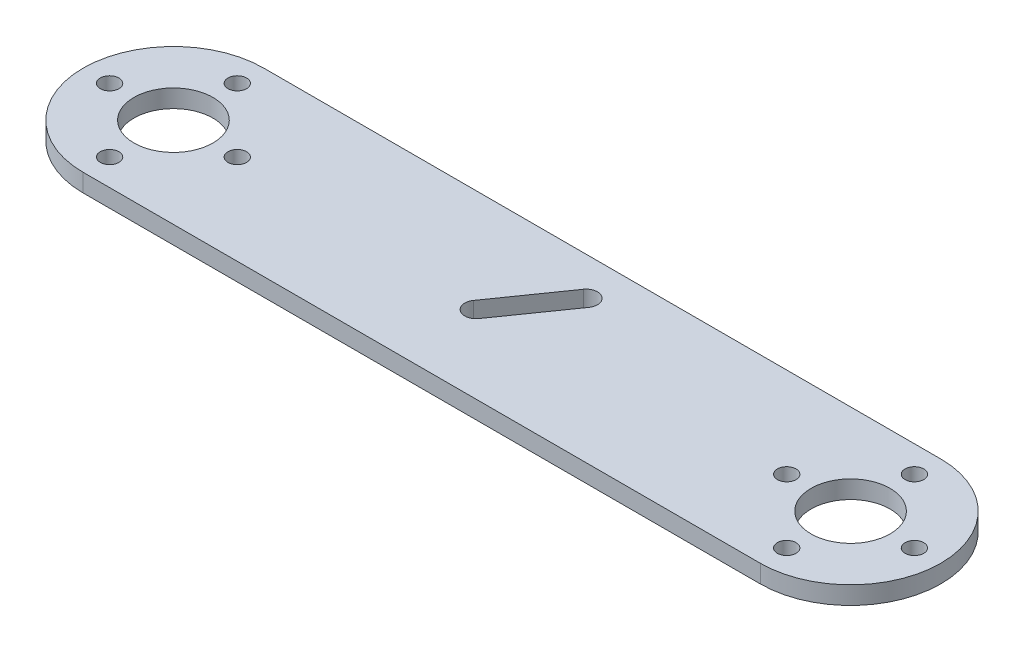
ISO-10303-21;
HEADER;
FILE_DESCRIPTION(('STEP AP214'),'2;1');
FILE_NAME('part.step','',(''),(''),'','','');
FILE_SCHEMA(('AUTOMOTIVE_DESIGN { 1 0 10303 214 1 1 1 1 }'));
ENDSEC;
DATA;
#1=APPLICATION_CONTEXT('core data for automotive mechanical design processes');
#2=APPLICATION_PROTOCOL_DEFINITION('international standard','automotive_design',2000,#1);
#3=PRODUCT_CONTEXT('',#1,'mechanical');
#4=PRODUCT('Part','Part','',(#3));
#5=PRODUCT_RELATED_PRODUCT_CATEGORY('part','',(#4));
#6=PRODUCT_DEFINITION_FORMATION('','',#4);
#7=PRODUCT_DEFINITION_CONTEXT('part definition',#1,'design');
#8=PRODUCT_DEFINITION('design','',#6,#7);
#9=PRODUCT_DEFINITION_SHAPE('','',#8);
#10=(LENGTH_UNIT() NAMED_UNIT(*) SI_UNIT(.MILLI.,.METRE.));
#11=(NAMED_UNIT(*) PLANE_ANGLE_UNIT() SI_UNIT($,.RADIAN.));
#12=(NAMED_UNIT(*) SI_UNIT($,.STERADIAN.) SOLID_ANGLE_UNIT());
#13=UNCERTAINTY_MEASURE_WITH_UNIT(LENGTH_MEASURE(1.E-05),#10,'distance_accuracy_value','');
#14=(GEOMETRIC_REPRESENTATION_CONTEXT(3) GLOBAL_UNCERTAINTY_ASSIGNED_CONTEXT((#13)) GLOBAL_UNIT_ASSIGNED_CONTEXT((#10,
#11,#12)) REPRESENTATION_CONTEXT('',''));
#15=CARTESIAN_POINT('',(0.,0.,0.));
#16=DIRECTION('',(0.,0.,1.));
#17=DIRECTION('',(1.,0.,0.));
#18=AXIS2_PLACEMENT_3D('',#15,#16,#17);
#19=CARTESIAN_POINT('',(0.,3.175,0.));
#20=DIRECTION('',(0.,1.,0.));
#21=DIRECTION('',(0.,0.,1.));
#22=AXIS2_PLACEMENT_3D('',#19,#20,#21);
#23=PLANE('',#22);
#24=CARTESIAN_POINT('',(131.313708498985,3.175,-16.));
#25=DIRECTION('',(0.,1.,0.));
#26=DIRECTION('',(0.,0.,1.));
#27=AXIS2_PLACEMENT_3D('',#24,#25,#26);
#28=CIRCLE('',#27,1.64999999999999);
#29=CARTESIAN_POINT('',(131.313708498985,3.175,-14.35));
#30=VERTEX_POINT('',#29);
#31=EDGE_CURVE('E284',#30,#30,#28,.F.);
#32=ORIENTED_EDGE('',*,*,#31,.T.);
#33=EDGE_LOOP('',(#32));
#34=FACE_BOUND('',#33,.T.);
#35=CARTESIAN_POINT('',(120.,3.175,-4.68629150101524));
#36=DIRECTION('',(0.,1.,0.));
#37=DIRECTION('',(0.,0.,1.));
#38=AXIS2_PLACEMENT_3D('',#35,#36,#37);
#39=CIRCLE('',#38,1.64999999999999);
#40=CARTESIAN_POINT('',(120.,3.175,-3.03629150101525));
#41=VERTEX_POINT('',#40);
#42=EDGE_CURVE('E281',#41,#41,#39,.F.);
#43=ORIENTED_EDGE('',*,*,#42,.T.);
#44=EDGE_LOOP('',(#43));
#45=FACE_BOUND('',#44,.T.);
#46=CARTESIAN_POINT('',(108.686291501015,3.175,-16.));
#47=DIRECTION('',(0.,1.,0.));
#48=DIRECTION('',(0.,0.,1.));
#49=AXIS2_PLACEMENT_3D('',#46,#47,#48);
#50=CIRCLE('',#49,1.64999999999999);
#51=CARTESIAN_POINT('',(108.686291501015,3.175,-14.35));
#52=VERTEX_POINT('',#51);
#53=EDGE_CURVE('E280',#52,#52,#50,.F.);
#54=ORIENTED_EDGE('',*,*,#53,.T.);
#55=EDGE_LOOP('',(#54));
#56=FACE_BOUND('',#55,.T.);
#57=CARTESIAN_POINT('',(120.,3.175,-27.3137084989848));
#58=DIRECTION('',(0.,1.,0.));
#59=DIRECTION('',(0.,0.,1.));
#60=AXIS2_PLACEMENT_3D('',#57,#58,#59);
#61=CIRCLE('',#60,1.64999999999999);
#62=CARTESIAN_POINT('',(120.,3.175,-25.6637084989848));
#63=VERTEX_POINT('',#62);
#64=EDGE_CURVE('E174',#63,#63,#61,.F.);
#65=ORIENTED_EDGE('',*,*,#64,.T.);
#66=EDGE_LOOP('',(#65));
#67=FACE_BOUND('',#66,.T.);
#68=DIRECTION('',(1.,0.,0.));
#69=VECTOR('',#68,1.);
#70=CARTESIAN_POINT('',(0.,3.175,-32.));
#71=LINE('',#70,#69);
#72=CARTESIAN_POINT('',(0.,3.175,-32.));
#73=VERTEX_POINT('',#72);
#74=CARTESIAN_POINT('',(120.,3.175,-32.));
#75=VERTEX_POINT('',#74);
#76=EDGE_CURVE('E160',#73,#75,#71,.T.);
#77=ORIENTED_EDGE('',*,*,#76,.F.);
#78=CARTESIAN_POINT('',(0.,3.175,-16.));
#79=DIRECTION('',(0.,1.,0.));
#80=DIRECTION('',(0.,0.,1.));
#81=AXIS2_PLACEMENT_3D('',#78,#79,#80);
#82=CIRCLE('',#81,16.);
#83=CARTESIAN_POINT('',(0.,3.175,0.));
#84=VERTEX_POINT('',#83);
#85=EDGE_CURVE('E273',#73,#84,#82,.T.);
#86=ORIENTED_EDGE('',*,*,#85,.T.);
#87=DIRECTION('',(1.,0.,0.));
#88=VECTOR('',#87,1.);
#89=CARTESIAN_POINT('',(0.,3.175,0.));
#90=LINE('',#89,#88);
#91=CARTESIAN_POINT('',(120.,3.175,0.));
#92=VERTEX_POINT('',#91);
#93=EDGE_CURVE('E261',#84,#92,#90,.T.);
#94=ORIENTED_EDGE('',*,*,#93,.T.);
#95=CARTESIAN_POINT('',(120.,3.175,-16.));
#96=DIRECTION('',(0.,1.,0.));
#97=DIRECTION('',(0.,0.,1.));
#98=AXIS2_PLACEMENT_3D('',#95,#96,#97);
#99=CIRCLE('',#98,16.);
#100=EDGE_CURVE('E266',#75,#92,#99,.F.);
#101=ORIENTED_EDGE('',*,*,#100,.F.);
#102=EDGE_LOOP('',(#77,#86,#94,#101));
#103=FACE_BOUND('',#102,.T.);
#104=CARTESIAN_POINT('',(120.,3.175,-16.));
#105=DIRECTION('',(0.,1.,0.));
#106=DIRECTION('',(0.,0.,1.));
#107=AXIS2_PLACEMENT_3D('',#104,#105,#106);
#108=CIRCLE('',#107,7.00000000000001);
#109=CARTESIAN_POINT('',(120.,3.175,-8.99999999999999));
#110=VERTEX_POINT('',#109);
#111=EDGE_CURVE('E269',#110,#110,#108,.T.);
#112=ORIENTED_EDGE('',*,*,#111,.F.);
#113=EDGE_LOOP('',(#112));
#114=FACE_BOUND('',#113,.T.);
#115=DIRECTION('',(0.573576436351049,0.,-0.81915204428899));
#116=VECTOR('',#115,1.);
#117=CARTESIAN_POINT('',(29.3892914502795,3.175,20.578603416128));
#118=LINE('',#117,#116);
#119=CARTESIAN_POINT('',(54.2392516879225,3.175,-14.9108177648824));
#120=VERTEX_POINT('',#119);
#121=CARTESIAN_POINT('',(62.2693217968372,3.175,-26.3789463849282));
#122=VERTEX_POINT('',#121);
#123=EDGE_CURVE('E122',#120,#122,#118,.T.);
#124=ORIENTED_EDGE('',*,*,#123,.T.);
#125=CARTESIAN_POINT('',(63.9076258854152,3.175,-25.2317935122261));
#126=DIRECTION('',(0.,1.,0.));
#127=DIRECTION('',(0.,0.,1.));
#128=AXIS2_PLACEMENT_3D('',#125,#126,#127);
#129=CIRCLE('',#128,2.00000000000001);
#130=CARTESIAN_POINT('',(65.5459299739932,3.175,-24.084640639524));
#131=VERTEX_POINT('',#130);
#132=EDGE_CURVE('E110',#131,#122,#129,.T.);
#133=ORIENTED_EDGE('',*,*,#132,.F.);
#134=DIRECTION('',(0.573576436351049,0.,-0.819152044288989));
#135=VECTOR('',#134,1.);
#136=CARTESIAN_POINT('',(32.6658996274354,3.175,22.8729091615322));
#137=LINE('',#136,#135);
#138=CARTESIAN_POINT('',(57.5158598650785,3.175,-12.6165120194782));
#139=VERTEX_POINT('',#138);
#140=EDGE_CURVE('E121',#139,#131,#137,.T.);
#141=ORIENTED_EDGE('',*,*,#140,.F.);
#142=CARTESIAN_POINT('',(55.8775557765005,3.175,-13.7636648921803));
#143=DIRECTION('',(0.,1.,0.));
#144=DIRECTION('',(0.,0.,1.));
#145=AXIS2_PLACEMENT_3D('',#142,#143,#144);
#146=CIRCLE('',#145,2.);
#147=EDGE_CURVE('E126',#120,#139,#146,.T.);
#148=ORIENTED_EDGE('',*,*,#147,.F.);
#149=EDGE_LOOP('',(#124,#133,#141,#148));
#150=FACE_BOUND('',#149,.T.);
#151=CARTESIAN_POINT('',(0.,3.175,-16.));
#152=DIRECTION('',(0.,1.,0.));
#153=DIRECTION('',(0.,0.,1.));
#154=AXIS2_PLACEMENT_3D('',#151,#152,#153);
#155=CIRCLE('',#154,7.);
#156=CARTESIAN_POINT('',(0.,3.175,-9.));
#157=VERTEX_POINT('',#156);
#158=EDGE_CURVE('E128',#157,#157,#155,.T.);
#159=ORIENTED_EDGE('',*,*,#158,.F.);
#160=EDGE_LOOP('',(#159));
#161=FACE_BOUND('',#160,.T.);
#162=CARTESIAN_POINT('',(0.,3.175,-4.68629150101524));
#163=DIRECTION('',(0.,1.,0.));
#164=DIRECTION('',(0.,0.,1.));
#165=AXIS2_PLACEMENT_3D('',#162,#163,#164);
#166=CIRCLE('',#165,1.65);
#167=CARTESIAN_POINT('',(0.,3.175,-3.03629150101524));
#168=VERTEX_POINT('',#167);
#169=EDGE_CURVE('E291',#168,#168,#166,.T.);
#170=ORIENTED_EDGE('',*,*,#169,.F.);
#171=EDGE_LOOP('',(#170));
#172=FACE_BOUND('',#171,.T.);
#173=CARTESIAN_POINT('',(11.3137084989848,3.175,-16.));
#174=DIRECTION('',(0.,1.,0.));
#175=DIRECTION('',(0.,0.,1.));
#176=AXIS2_PLACEMENT_3D('',#173,#174,#175);
#177=CIRCLE('',#176,1.65);
#178=CARTESIAN_POINT('',(11.3137084989848,3.175,-14.35));
#179=VERTEX_POINT('',#178);
#180=EDGE_CURVE('E294',#179,#179,#177,.T.);
#181=ORIENTED_EDGE('',*,*,#180,.F.);
#182=EDGE_LOOP('',(#181));
#183=FACE_BOUND('',#182,.T.);
#184=CARTESIAN_POINT('',(0.,3.175,-27.3137084989848));
#185=DIRECTION('',(0.,1.,0.));
#186=DIRECTION('',(0.,0.,1.));
#187=AXIS2_PLACEMENT_3D('',#184,#185,#186);
#188=CIRCLE('',#187,1.65);
#189=CARTESIAN_POINT('',(0.,3.175,-25.6637084989848));
#190=VERTEX_POINT('',#189);
#191=EDGE_CURVE('E289',#190,#190,#188,.T.);
#192=ORIENTED_EDGE('',*,*,#191,.F.);
#193=EDGE_LOOP('',(#192));
#194=FACE_BOUND('',#193,.T.);
#195=CARTESIAN_POINT('',(-11.3137084989848,3.175,-16.));
#196=DIRECTION('',(0.,1.,0.));
#197=DIRECTION('',(0.,0.,1.));
#198=AXIS2_PLACEMENT_3D('',#195,#196,#197);
#199=CIRCLE('',#198,1.65);
#200=CARTESIAN_POINT('',(-11.3137084989848,3.175,-14.35));
#201=VERTEX_POINT('',#200);
#202=EDGE_CURVE('E287',#201,#201,#199,.T.);
#203=ORIENTED_EDGE('',*,*,#202,.F.);
#204=EDGE_LOOP('',(#203));
#205=FACE_BOUND('',#204,.T.);
#206=ADVANCED_FACE('F35',(#34,#45,#56,#67,#103,#114,#150,#161,#172,#183,#194,#205),#23,.T.);
#207=CARTESIAN_POINT('',(0.,0.,0.));
#208=DIRECTION('',(0.,1.,0.));
#209=DIRECTION('',(0.,0.,1.));
#210=AXIS2_PLACEMENT_3D('',#207,#208,#209);
#211=PLANE('',#210);
#212=CARTESIAN_POINT('',(0.,0.,-27.3137084989848));
#213=DIRECTION('',(0.,1.,0.));
#214=DIRECTION('',(0.,0.,1.));
#215=AXIS2_PLACEMENT_3D('',#212,#213,#214);
#216=CIRCLE('',#215,1.65);
#217=CARTESIAN_POINT('',(0.,0.,-25.6637084989848));
#218=VERTEX_POINT('',#217);
#219=EDGE_CURVE('E180',#218,#218,#216,.T.);
#220=ORIENTED_EDGE('',*,*,#219,.T.);
#221=EDGE_LOOP('',(#220));
#222=FACE_BOUND('',#221,.T.);
#223=CARTESIAN_POINT('',(0.,0.,-4.68629150101524));
#224=DIRECTION('',(0.,1.,0.));
#225=DIRECTION('',(0.,0.,1.));
#226=AXIS2_PLACEMENT_3D('',#223,#224,#225);
#227=CIRCLE('',#226,1.65);
#228=CARTESIAN_POINT('',(0.,0.,-3.03629150101524));
#229=VERTEX_POINT('',#228);
#230=EDGE_CURVE('E173',#229,#229,#227,.T.);
#231=ORIENTED_EDGE('',*,*,#230,.T.);
#232=EDGE_LOOP('',(#231));
#233=FACE_BOUND('',#232,.T.);
#234=CARTESIAN_POINT('',(120.,0.,-27.3137084989848));
#235=DIRECTION('',(0.,1.,0.));
#236=DIRECTION('',(0.,0.,1.));
#237=AXIS2_PLACEMENT_3D('',#234,#235,#236);
#238=CIRCLE('',#237,1.64999999999999);
#239=CARTESIAN_POINT('',(120.,0.,-25.6637084989848));
#240=VERTEX_POINT('',#239);
#241=EDGE_CURVE('E170',#240,#240,#238,.F.);
#242=ORIENTED_EDGE('',*,*,#241,.F.);
#243=EDGE_LOOP('',(#242));
#244=FACE_BOUND('',#243,.T.);
#245=DIRECTION('',(1.,0.,0.));
#246=VECTOR('',#245,1.);
#247=CARTESIAN_POINT('',(0.,0.,-32.));
#248=LINE('',#247,#246);
#249=CARTESIAN_POINT('',(0.,0.,-32.));
#250=VERTEX_POINT('',#249);
#251=CARTESIAN_POINT('',(120.,0.,-32.));
#252=VERTEX_POINT('',#251);
#253=EDGE_CURVE('E135',#250,#252,#248,.T.);
#254=ORIENTED_EDGE('',*,*,#253,.T.);
#255=CARTESIAN_POINT('',(120.,0.,-16.));
#256=DIRECTION('',(0.,1.,0.));
#257=DIRECTION('',(0.,0.,1.));
#258=AXIS2_PLACEMENT_3D('',#255,#256,#257);
#259=CIRCLE('',#258,16.);
#260=CARTESIAN_POINT('',(120.,0.,0.));
#261=VERTEX_POINT('',#260);
#262=EDGE_CURVE('E143',#252,#261,#259,.F.);
#263=ORIENTED_EDGE('',*,*,#262,.T.);
#264=DIRECTION('',(1.,0.,0.));
#265=VECTOR('',#264,1.);
#266=CARTESIAN_POINT('',(0.,0.,0.));
#267=LINE('',#266,#265);
#268=CARTESIAN_POINT('',(0.,0.,0.));
#269=VERTEX_POINT('',#268);
#270=EDGE_CURVE('E140',#269,#261,#267,.T.);
#271=ORIENTED_EDGE('',*,*,#270,.F.);
#272=CARTESIAN_POINT('',(0.,0.,-16.));
#273=DIRECTION('',(0.,1.,0.));
#274=DIRECTION('',(0.,0.,1.));
#275=AXIS2_PLACEMENT_3D('',#272,#273,#274);
#276=CIRCLE('',#275,16.);
#277=EDGE_CURVE('E138',#250,#269,#276,.T.);
#278=ORIENTED_EDGE('',*,*,#277,.F.);
#279=EDGE_LOOP('',(#254,#263,#271,#278));
#280=FACE_BOUND('',#279,.T.);
#281=CARTESIAN_POINT('',(120.,0.,-16.));
#282=DIRECTION('',(0.,1.,0.));
#283=DIRECTION('',(0.,0.,1.));
#284=AXIS2_PLACEMENT_3D('',#281,#282,#283);
#285=CIRCLE('',#284,7.00000000000001);
#286=CARTESIAN_POINT('',(120.,0.,-8.99999999999999));
#287=VERTEX_POINT('',#286);
#288=EDGE_CURVE('E146',#287,#287,#285,.T.);
#289=ORIENTED_EDGE('',*,*,#288,.T.);
#290=EDGE_LOOP('',(#289));
#291=FACE_BOUND('',#290,.T.);
#292=DIRECTION('',(0.573576436351049,0.,-0.81915204428899));
#293=VECTOR('',#292,1.);
#294=CARTESIAN_POINT('',(29.3892914502795,0.,20.578603416128));
#295=LINE('',#294,#293);
#296=CARTESIAN_POINT('',(54.2392516879225,0.,-14.9108177648824));
#297=VERTEX_POINT('',#296);
#298=CARTESIAN_POINT('',(62.2693217968372,0.,-26.3789463849282));
#299=VERTEX_POINT('',#298);
#300=EDGE_CURVE('E149',#297,#299,#295,.T.);
#301=ORIENTED_EDGE('',*,*,#300,.F.);
#302=CARTESIAN_POINT('',(55.8775557765005,0.,-13.7636648921803));
#303=DIRECTION('',(0.,1.,0.));
#304=DIRECTION('',(0.,0.,1.));
#305=AXIS2_PLACEMENT_3D('',#302,#303,#304);
#306=CIRCLE('',#305,2.);
#307=CARTESIAN_POINT('',(57.5158598650785,0.,-12.6165120194782));
#308=VERTEX_POINT('',#307);
#309=EDGE_CURVE('E154',#297,#308,#306,.T.);
#310=ORIENTED_EDGE('',*,*,#309,.T.);
#311=DIRECTION('',(0.573576436351049,0.,-0.819152044288989));
#312=VECTOR('',#311,1.);
#313=CARTESIAN_POINT('',(32.6658996274354,0.,22.8729091615322));
#314=LINE('',#313,#312);
#315=CARTESIAN_POINT('',(65.5459299739932,0.,-24.084640639524));
#316=VERTEX_POINT('',#315);
#317=EDGE_CURVE('E152',#308,#316,#314,.T.);
#318=ORIENTED_EDGE('',*,*,#317,.T.);
#319=CARTESIAN_POINT('',(63.9076258854152,0.,-25.2317935122261));
#320=DIRECTION('',(0.,1.,0.));
#321=DIRECTION('',(0.,0.,1.));
#322=AXIS2_PLACEMENT_3D('',#319,#320,#321);
#323=CIRCLE('',#322,2.00000000000001);
#324=EDGE_CURVE('E112',#316,#299,#323,.T.);
#325=ORIENTED_EDGE('',*,*,#324,.T.);
#326=EDGE_LOOP('',(#301,#310,#318,#325));
#327=FACE_BOUND('',#326,.T.);
#328=CARTESIAN_POINT('',(0.,0.,-16.));
#329=DIRECTION('',(0.,1.,0.));
#330=DIRECTION('',(0.,0.,1.));
#331=AXIS2_PLACEMENT_3D('',#328,#329,#330);
#332=CIRCLE('',#331,7.);
#333=CARTESIAN_POINT('',(0.,0.,-9.));
#334=VERTEX_POINT('',#333);
#335=EDGE_CURVE('E157',#334,#334,#332,.T.);
#336=ORIENTED_EDGE('',*,*,#335,.T.);
#337=EDGE_LOOP('',(#336));
#338=FACE_BOUND('',#337,.T.);
#339=CARTESIAN_POINT('',(11.3137084989848,0.,-16.));
#340=DIRECTION('',(0.,1.,0.));
#341=DIRECTION('',(0.,0.,1.));
#342=AXIS2_PLACEMENT_3D('',#339,#340,#341);
#343=CIRCLE('',#342,1.65);
#344=CARTESIAN_POINT('',(11.3137084989848,0.,-14.35));
#345=VERTEX_POINT('',#344);
#346=EDGE_CURVE('E177',#345,#345,#343,.T.);
#347=ORIENTED_EDGE('',*,*,#346,.T.);
#348=EDGE_LOOP('',(#347));
#349=FACE_BOUND('',#348,.T.);
#350=CARTESIAN_POINT('',(108.686291501015,0.,-16.));
#351=DIRECTION('',(0.,1.,0.));
#352=DIRECTION('',(0.,0.,1.));
#353=AXIS2_PLACEMENT_3D('',#350,#351,#352);
#354=CIRCLE('',#353,1.64999999999999);
#355=CARTESIAN_POINT('',(108.686291501015,0.,-14.35));
#356=VERTEX_POINT('',#355);
#357=EDGE_CURVE('E183',#356,#356,#354,.F.);
#358=ORIENTED_EDGE('',*,*,#357,.F.);
#359=EDGE_LOOP('',(#358));
#360=FACE_BOUND('',#359,.T.);
#361=CARTESIAN_POINT('',(120.,0.,-4.68629150101524));
#362=DIRECTION('',(0.,1.,0.));
#363=DIRECTION('',(0.,0.,1.));
#364=AXIS2_PLACEMENT_3D('',#361,#362,#363);
#365=CIRCLE('',#364,1.64999999999999);
#366=CARTESIAN_POINT('',(120.,0.,-3.03629150101525));
#367=VERTEX_POINT('',#366);
#368=EDGE_CURVE('E186',#367,#367,#365,.F.);
#369=ORIENTED_EDGE('',*,*,#368,.F.);
#370=EDGE_LOOP('',(#369));
#371=FACE_BOUND('',#370,.T.);
#372=CARTESIAN_POINT('',(131.313708498985,0.,-16.));
#373=DIRECTION('',(0.,1.,0.));
#374=DIRECTION('',(0.,0.,1.));
#375=AXIS2_PLACEMENT_3D('',#372,#373,#374);
#376=CIRCLE('',#375,1.64999999999999);
#377=CARTESIAN_POINT('',(131.313708498985,0.,-14.35));
#378=VERTEX_POINT('',#377);
#379=EDGE_CURVE('E188',#378,#378,#376,.F.);
#380=ORIENTED_EDGE('',*,*,#379,.F.);
#381=EDGE_LOOP('',(#380));
#382=FACE_BOUND('',#381,.T.);
#383=CARTESIAN_POINT('',(-11.3137084989848,0.,-16.));
#384=DIRECTION('',(0.,1.,0.));
#385=DIRECTION('',(0.,0.,1.));
#386=AXIS2_PLACEMENT_3D('',#383,#384,#385);
#387=CIRCLE('',#386,1.65);
#388=CARTESIAN_POINT('',(-11.3137084989848,0.,-14.35));
#389=VERTEX_POINT('',#388);
#390=EDGE_CURVE('E39',#389,#389,#387,.T.);
#391=ORIENTED_EDGE('',*,*,#390,.T.);
#392=EDGE_LOOP('',(#391));
#393=FACE_BOUND('',#392,.T.);
#394=ADVANCED_FACE('F195',(#222,#233,#244,#280,#291,#327,#338,#349,#360,#371,#382,#393),#211,.F.);
#395=CARTESIAN_POINT('',(29.3892914502795,3.175,20.578603416128));
#396=DIRECTION('',(-0.81915204428899,0.,-0.573576436351049));
#397=DIRECTION('',(-0.573576436351049,0.,0.81915204428899));
#398=AXIS2_PLACEMENT_3D('',#395,#396,#397);
#399=PLANE('',#398);
#400=ORIENTED_EDGE('',*,*,#300,.T.);
#401=DIRECTION('',(0.,-1.,0.));
#402=VECTOR('',#401,1.);
#403=CARTESIAN_POINT('',(62.2693217968372,3.175,-26.3789463849282));
#404=LINE('',#403,#402);
#405=EDGE_CURVE('E11',#122,#299,#404,.T.);
#406=ORIENTED_EDGE('',*,*,#405,.F.);
#407=ORIENTED_EDGE('',*,*,#123,.F.);
#408=DIRECTION('',(0.,-1.,0.));
#409=VECTOR('',#408,1.);
#410=CARTESIAN_POINT('',(54.2392516879225,3.175,-14.9108177648824));
#411=LINE('',#410,#409);
#412=EDGE_CURVE('E54',#120,#297,#411,.T.);
#413=ORIENTED_EDGE('',*,*,#412,.T.);
#414=EDGE_LOOP('',(#400,#406,#407,#413));
#415=FACE_BOUND('',#414,.T.);
#416=ADVANCED_FACE('F216',(#415),#399,.F.);
#417=CARTESIAN_POINT('',(63.9076258854152,3.175,-25.2317935122261));
#418=DIRECTION('',(0.,-1.,0.));
#419=DIRECTION('',(0.,0.,-1.));
#420=AXIS2_PLACEMENT_3D('',#417,#418,#419);
#421=CYLINDRICAL_SURFACE('',#420,2.00000000000001);
#422=ORIENTED_EDGE('',*,*,#324,.F.);
#423=DIRECTION('',(0.,-1.,0.));
#424=VECTOR('',#423,1.);
#425=CARTESIAN_POINT('',(65.5459299739932,3.175,-24.084640639524));
#426=LINE('',#425,#424);
#427=EDGE_CURVE('E45',#131,#316,#426,.T.);
#428=ORIENTED_EDGE('',*,*,#427,.F.);
#429=ORIENTED_EDGE('',*,*,#132,.T.);
#430=ORIENTED_EDGE('',*,*,#405,.T.);
#431=EDGE_LOOP('',(#422,#428,#429,#430));
#432=FACE_BOUND('',#431,.T.);
#433=ADVANCED_FACE('F109',(#432),#421,.F.);
#434=CARTESIAN_POINT('',(32.6658996274354,3.175,22.8729091615322));
#435=DIRECTION('',(-0.819152044288989,0.,-0.573576436351049));
#436=DIRECTION('',(-0.573576436351049,0.,0.819152044288989));
#437=AXIS2_PLACEMENT_3D('',#434,#435,#436);
#438=PLANE('',#437);
#439=ORIENTED_EDGE('',*,*,#317,.F.);
#440=DIRECTION('',(0.,-1.,0.));
#441=VECTOR('',#440,1.);
#442=CARTESIAN_POINT('',(57.5158598650785,3.175,-12.6165120194782));
#443=LINE('',#442,#441);
#444=EDGE_CURVE('E79',#139,#308,#443,.T.);
#445=ORIENTED_EDGE('',*,*,#444,.F.);
#446=ORIENTED_EDGE('',*,*,#140,.T.);
#447=ORIENTED_EDGE('',*,*,#427,.T.);
#448=EDGE_LOOP('',(#439,#445,#446,#447));
#449=FACE_BOUND('',#448,.T.);
#450=ADVANCED_FACE('F125',(#449),#438,.T.);
#451=CARTESIAN_POINT('',(0.,3.175,-32.));
#452=DIRECTION('',(0.,0.,-1.));
#453=DIRECTION('',(-1.,0.,0.));
#454=AXIS2_PLACEMENT_3D('',#451,#452,#453);
#455=PLANE('',#454);
#456=ORIENTED_EDGE('',*,*,#253,.F.);
#457=DIRECTION('',(0.,-1.,0.));
#458=VECTOR('',#457,1.);
#459=CARTESIAN_POINT('',(0.,3.175,-32.));
#460=LINE('',#459,#458);
#461=EDGE_CURVE('E91',#73,#250,#460,.T.);
#462=ORIENTED_EDGE('',*,*,#461,.F.);
#463=ORIENTED_EDGE('',*,*,#76,.T.);
#464=DIRECTION('',(0.,-1.,0.));
#465=VECTOR('',#464,1.);
#466=CARTESIAN_POINT('',(120.,3.175,-32.));
#467=LINE('',#466,#465);
#468=EDGE_CURVE('E134',#75,#252,#467,.T.);
#469=ORIENTED_EDGE('',*,*,#468,.T.);
#470=EDGE_LOOP('',(#456,#462,#463,#469));
#471=FACE_BOUND('',#470,.T.);
#472=ADVANCED_FACE('F37',(#471),#455,.T.);
#473=CARTESIAN_POINT('',(0.,3.175,-16.));
#474=DIRECTION('',(0.,-1.,0.));
#475=DIRECTION('',(0.,0.,-1.));
#476=AXIS2_PLACEMENT_3D('',#473,#474,#475);
#477=CYLINDRICAL_SURFACE('',#476,16.);
#478=ORIENTED_EDGE('',*,*,#277,.T.);
#479=DIRECTION('',(0.,-1.,0.));
#480=VECTOR('',#479,1.);
#481=CARTESIAN_POINT('',(0.,3.175,0.));
#482=LINE('',#481,#480);
#483=EDGE_CURVE('E166',#84,#269,#482,.T.);
#484=ORIENTED_EDGE('',*,*,#483,.F.);
#485=ORIENTED_EDGE('',*,*,#85,.F.);
#486=ORIENTED_EDGE('',*,*,#461,.T.);
#487=EDGE_LOOP('',(#478,#484,#485,#486));
#488=FACE_BOUND('',#487,.T.);
#489=ADVANCED_FACE('F248',(#488),#477,.T.);
#490=CARTESIAN_POINT('',(0.,3.175,0.));
#491=DIRECTION('',(0.,0.,-1.));
#492=DIRECTION('',(-1.,0.,0.));
#493=AXIS2_PLACEMENT_3D('',#490,#491,#492);
#494=PLANE('',#493);
#495=ORIENTED_EDGE('',*,*,#270,.T.);
#496=DIRECTION('',(0.,-1.,0.));
#497=VECTOR('',#496,1.);
#498=CARTESIAN_POINT('',(120.,3.175,0.));
#499=LINE('',#498,#497);
#500=EDGE_CURVE('E164',#92,#261,#499,.T.);
#501=ORIENTED_EDGE('',*,*,#500,.F.);
#502=ORIENTED_EDGE('',*,*,#93,.F.);
#503=ORIENTED_EDGE('',*,*,#483,.T.);
#504=EDGE_LOOP('',(#495,#501,#502,#503));
#505=FACE_BOUND('',#504,.T.);
#506=ADVANCED_FACE('F234',(#505),#494,.F.);
#507=CARTESIAN_POINT('',(55.8775557765005,3.175,-13.7636648921803));
#508=DIRECTION('',(0.,-1.,0.));
#509=DIRECTION('',(0.,0.,-1.));
#510=AXIS2_PLACEMENT_3D('',#507,#508,#509);
#511=CYLINDRICAL_SURFACE('',#510,2.);
#512=ORIENTED_EDGE('',*,*,#309,.F.);
#513=ORIENTED_EDGE('',*,*,#412,.F.);
#514=ORIENTED_EDGE('',*,*,#147,.T.);
#515=ORIENTED_EDGE('',*,*,#444,.T.);
#516=EDGE_LOOP('',(#512,#513,#514,#515));
#517=FACE_BOUND('',#516,.T.);
#518=ADVANCED_FACE('F230',(#517),#511,.F.);
#519=CARTESIAN_POINT('',(120.,3.175,-16.));
#520=DIRECTION('',(0.,-1.,0.));
#521=DIRECTION('',(0.,0.,-1.));
#522=AXIS2_PLACEMENT_3D('',#519,#520,#521);
#523=CYLINDRICAL_SURFACE('',#522,7.00000000000001);
#524=ORIENTED_EDGE('',*,*,#111,.T.);
#525=EDGE_LOOP('',(#524));
#526=FACE_BOUND('',#525,.T.);
#527=ORIENTED_EDGE('',*,*,#288,.F.);
#528=EDGE_LOOP('',(#527));
#529=FACE_BOUND('',#528,.T.);
#530=ADVANCED_FACE('F233',(#526,#529),#523,.F.);
#531=CARTESIAN_POINT('',(120.,3.175,-16.));
#532=DIRECTION('',(0.,-1.,0.));
#533=DIRECTION('',(0.,0.,-1.));
#534=AXIS2_PLACEMENT_3D('',#531,#532,#533);
#535=CYLINDRICAL_SURFACE('',#534,16.);
#536=ORIENTED_EDGE('',*,*,#262,.F.);
#537=ORIENTED_EDGE('',*,*,#468,.F.);
#538=ORIENTED_EDGE('',*,*,#100,.T.);
#539=ORIENTED_EDGE('',*,*,#500,.T.);
#540=EDGE_LOOP('',(#536,#537,#538,#539));
#541=FACE_BOUND('',#540,.T.);
#542=ADVANCED_FACE('F228',(#541),#535,.T.);
#543=CARTESIAN_POINT('',(0.,3.175,-16.));
#544=DIRECTION('',(0.,-1.,0.));
#545=DIRECTION('',(0.,0.,-1.));
#546=AXIS2_PLACEMENT_3D('',#543,#544,#545);
#547=CYLINDRICAL_SURFACE('',#546,7.);
#548=ORIENTED_EDGE('',*,*,#158,.T.);
#549=EDGE_LOOP('',(#548));
#550=FACE_BOUND('',#549,.T.);
#551=ORIENTED_EDGE('',*,*,#335,.F.);
#552=EDGE_LOOP('',(#551));
#553=FACE_BOUND('',#552,.T.);
#554=ADVANCED_FACE('F225',(#550,#553),#547,.F.);
#555=CARTESIAN_POINT('',(120.,-6.825,-27.3137084989848));
#556=DIRECTION('',(0.,1.,0.));
#557=DIRECTION('',(0.,0.,1.));
#558=AXIS2_PLACEMENT_3D('',#555,#556,#557);
#559=CYLINDRICAL_SURFACE('',#558,1.64999999999999);
#560=ORIENTED_EDGE('',*,*,#64,.F.);
#561=EDGE_LOOP('',(#560));
#562=FACE_BOUND('',#561,.T.);
#563=ORIENTED_EDGE('',*,*,#241,.T.);
#564=EDGE_LOOP('',(#563));
#565=FACE_BOUND('',#564,.T.);
#566=ADVANCED_FACE('F222',(#562,#565),#559,.F.);
#567=CARTESIAN_POINT('',(0.,-6.825,-4.68629150101524));
#568=DIRECTION('',(0.,1.,0.));
#569=DIRECTION('',(0.,0.,1.));
#570=AXIS2_PLACEMENT_3D('',#567,#568,#569);
#571=CYLINDRICAL_SURFACE('',#570,1.65);
#572=ORIENTED_EDGE('',*,*,#169,.T.);
#573=EDGE_LOOP('',(#572));
#574=FACE_BOUND('',#573,.T.);
#575=ORIENTED_EDGE('',*,*,#230,.F.);
#576=EDGE_LOOP('',(#575));
#577=FACE_BOUND('',#576,.T.);
#578=ADVANCED_FACE('F316',(#574,#577),#571,.F.);
#579=CARTESIAN_POINT('',(11.3137084989848,-6.825,-16.));
#580=DIRECTION('',(0.,1.,0.));
#581=DIRECTION('',(0.,0.,1.));
#582=AXIS2_PLACEMENT_3D('',#579,#580,#581);
#583=CYLINDRICAL_SURFACE('',#582,1.65);
#584=ORIENTED_EDGE('',*,*,#180,.T.);
#585=EDGE_LOOP('',(#584));
#586=FACE_BOUND('',#585,.T.);
#587=ORIENTED_EDGE('',*,*,#346,.F.);
#588=EDGE_LOOP('',(#587));
#589=FACE_BOUND('',#588,.T.);
#590=ADVANCED_FACE('F307',(#586,#589),#583,.F.);
#591=CARTESIAN_POINT('',(0.,-6.825,-27.3137084989848));
#592=DIRECTION('',(0.,1.,0.));
#593=DIRECTION('',(0.,0.,1.));
#594=AXIS2_PLACEMENT_3D('',#591,#592,#593);
#595=CYLINDRICAL_SURFACE('',#594,1.65);
#596=ORIENTED_EDGE('',*,*,#191,.T.);
#597=EDGE_LOOP('',(#596));
#598=FACE_BOUND('',#597,.T.);
#599=ORIENTED_EDGE('',*,*,#219,.F.);
#600=EDGE_LOOP('',(#599));
#601=FACE_BOUND('',#600,.T.);
#602=ADVANCED_FACE('F300',(#598,#601),#595,.F.);
#603=CARTESIAN_POINT('',(108.686291501015,-6.825,-16.));
#604=DIRECTION('',(0.,1.,0.));
#605=DIRECTION('',(0.,0.,1.));
#606=AXIS2_PLACEMENT_3D('',#603,#604,#605);
#607=CYLINDRICAL_SURFACE('',#606,1.64999999999999);
#608=ORIENTED_EDGE('',*,*,#53,.F.);
#609=EDGE_LOOP('',(#608));
#610=FACE_BOUND('',#609,.T.);
#611=ORIENTED_EDGE('',*,*,#357,.T.);
#612=EDGE_LOOP('',(#611));
#613=FACE_BOUND('',#612,.T.);
#614=ADVANCED_FACE('F306',(#610,#613),#607,.F.);
#615=CARTESIAN_POINT('',(120.,-6.825,-4.68629150101524));
#616=DIRECTION('',(0.,1.,0.));
#617=DIRECTION('',(0.,0.,1.));
#618=AXIS2_PLACEMENT_3D('',#615,#616,#617);
#619=CYLINDRICAL_SURFACE('',#618,1.64999999999999);
#620=ORIENTED_EDGE('',*,*,#42,.F.);
#621=EDGE_LOOP('',(#620));
#622=FACE_BOUND('',#621,.T.);
#623=ORIENTED_EDGE('',*,*,#368,.T.);
#624=EDGE_LOOP('',(#623));
#625=FACE_BOUND('',#624,.T.);
#626=ADVANCED_FACE('F205',(#622,#625),#619,.F.);
#627=CARTESIAN_POINT('',(131.313708498985,-6.825,-16.));
#628=DIRECTION('',(0.,1.,0.));
#629=DIRECTION('',(0.,0.,1.));
#630=AXIS2_PLACEMENT_3D('',#627,#628,#629);
#631=CYLINDRICAL_SURFACE('',#630,1.64999999999999);
#632=ORIENTED_EDGE('',*,*,#31,.F.);
#633=EDGE_LOOP('',(#632));
#634=FACE_BOUND('',#633,.T.);
#635=ORIENTED_EDGE('',*,*,#379,.T.);
#636=EDGE_LOOP('',(#635));
#637=FACE_BOUND('',#636,.T.);
#638=ADVANCED_FACE('F199',(#634,#637),#631,.F.);
#639=CARTESIAN_POINT('',(-11.3137084989848,-6.825,-16.));
#640=DIRECTION('',(0.,1.,0.));
#641=DIRECTION('',(0.,0.,1.));
#642=AXIS2_PLACEMENT_3D('',#639,#640,#641);
#643=CYLINDRICAL_SURFACE('',#642,1.65);
#644=ORIENTED_EDGE('',*,*,#202,.T.);
#645=EDGE_LOOP('',(#644));
#646=FACE_BOUND('',#645,.T.);
#647=ORIENTED_EDGE('',*,*,#390,.F.);
#648=EDGE_LOOP('',(#647));
#649=FACE_BOUND('',#648,.T.);
#650=ADVANCED_FACE('F197',(#646,#649),#643,.F.);
#651=CLOSED_SHELL('',(#206,#394,#416,#433,#450,#472,#489,#506,#518,#530,#542,#554,#566,#578,
#590,#602,#614,#626,#638,#650));
#652=MANIFOLD_SOLID_BREP('B2',#651);
#653=ADVANCED_BREP_SHAPE_REPRESENTATION('',(#18,#652),#14);
#654=SHAPE_DEFINITION_REPRESENTATION(#9,#653);
ENDSEC;
END-ISO-10303-21;
